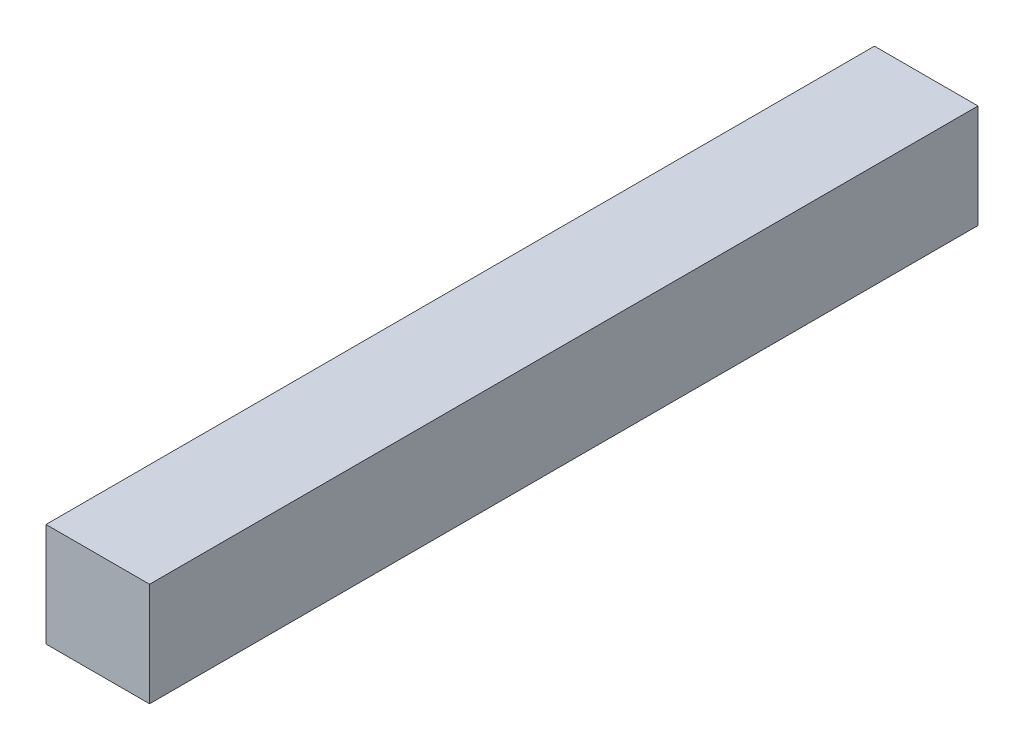
ISO-10303-21;
HEADER;
FILE_DESCRIPTION(('STEP AP214'),'2;1');
FILE_NAME('part.step','',(''),(''),'','','');
FILE_SCHEMA(('AUTOMOTIVE_DESIGN { 1 0 10303 214 1 1 1 1 }'));
ENDSEC;
DATA;
#1=APPLICATION_CONTEXT('core data for automotive mechanical design processes');
#2=APPLICATION_PROTOCOL_DEFINITION('international standard','automotive_design',2000,#1);
#3=PRODUCT_CONTEXT('',#1,'mechanical');
#4=PRODUCT('Part','Part','',(#3));
#5=PRODUCT_RELATED_PRODUCT_CATEGORY('part','',(#4));
#6=PRODUCT_DEFINITION_FORMATION('','',#4);
#7=PRODUCT_DEFINITION_CONTEXT('part definition',#1,'design');
#8=PRODUCT_DEFINITION('design','',#6,#7);
#9=PRODUCT_DEFINITION_SHAPE('','',#8);
#10=(LENGTH_UNIT() NAMED_UNIT(*) SI_UNIT(.MILLI.,.METRE.));
#11=(NAMED_UNIT(*) PLANE_ANGLE_UNIT() SI_UNIT($,.RADIAN.));
#12=(NAMED_UNIT(*) SI_UNIT($,.STERADIAN.) SOLID_ANGLE_UNIT());
#13=UNCERTAINTY_MEASURE_WITH_UNIT(LENGTH_MEASURE(1.E-05),#10,'distance_accuracy_value','');
#14=(GEOMETRIC_REPRESENTATION_CONTEXT(3) GLOBAL_UNCERTAINTY_ASSIGNED_CONTEXT((#13)) GLOBAL_UNIT_ASSIGNED_CONTEXT((#10,
#11,#12)) REPRESENTATION_CONTEXT('',''));
#15=CARTESIAN_POINT('',(0.,0.,0.));
#16=DIRECTION('',(0.,0.,1.));
#17=DIRECTION('',(1.,0.,0.));
#18=AXIS2_PLACEMENT_3D('',#15,#16,#17);
#19=CARTESIAN_POINT('',(0.,0.,-40.));
#20=DIRECTION('',(-1.,0.,0.));
#21=DIRECTION('',(0.,0.,1.));
#22=AXIS2_PLACEMENT_3D('',#19,#20,#21);
#23=PLANE('',#22);
#24=DIRECTION('',(0.,-1.,0.));
#25=VECTOR('',#24,1.);
#26=CARTESIAN_POINT('',(0.,0.,0.));
#27=LINE('',#26,#25);
#28=CARTESIAN_POINT('',(0.,5.,0.));
#29=VERTEX_POINT('',#28);
#30=CARTESIAN_POINT('',(0.,0.,0.));
#31=VERTEX_POINT('',#30);
#32=EDGE_CURVE('E106',#29,#31,#27,.T.);
#33=ORIENTED_EDGE('',*,*,#32,.F.);
#34=DIRECTION('',(0.,0.,1.));
#35=VECTOR('',#34,1.);
#36=CARTESIAN_POINT('',(0.,5.,-40.));
#37=LINE('',#36,#35);
#38=CARTESIAN_POINT('',(0.,5.,-40.));
#39=VERTEX_POINT('',#38);
#40=EDGE_CURVE('E11',#39,#29,#37,.T.);
#41=ORIENTED_EDGE('',*,*,#40,.F.);
#42=DIRECTION('',(0.,-1.,0.));
#43=VECTOR('',#42,1.);
#44=CARTESIAN_POINT('',(0.,0.,-40.));
#45=LINE('',#44,#43);
#46=CARTESIAN_POINT('',(0.,0.,-40.));
#47=VERTEX_POINT('',#46);
#48=EDGE_CURVE('E100',#39,#47,#45,.T.);
#49=ORIENTED_EDGE('',*,*,#48,.T.);
#50=DIRECTION('',(0.,0.,1.));
#51=VECTOR('',#50,1.);
#52=CARTESIAN_POINT('',(0.,0.,-40.));
#53=LINE('',#52,#51);
#54=EDGE_CURVE('E45',#47,#31,#53,.T.);
#55=ORIENTED_EDGE('',*,*,#54,.T.);
#56=EDGE_LOOP('',(#33,#41,#49,#55));
#57=FACE_BOUND('',#56,.T.);
#58=ADVANCED_FACE('F42',(#57),#23,.T.);
#59=CARTESIAN_POINT('',(0.,5.,-40.));
#60=DIRECTION('',(0.,1.,0.));
#61=DIRECTION('',(0.,0.,1.));
#62=AXIS2_PLACEMENT_3D('',#59,#60,#61);
#63=PLANE('',#62);
#64=DIRECTION('',(-1.,0.,0.));
#65=VECTOR('',#64,1.);
#66=CARTESIAN_POINT('',(0.,5.,0.));
#67=LINE('',#66,#65);
#68=CARTESIAN_POINT('',(5.,5.,0.));
#69=VERTEX_POINT('',#68);
#70=EDGE_CURVE('E102',#69,#29,#67,.T.);
#71=ORIENTED_EDGE('',*,*,#70,.F.);
#72=DIRECTION('',(0.,0.,1.));
#73=VECTOR('',#72,1.);
#74=CARTESIAN_POINT('',(5.,5.,-40.));
#75=LINE('',#74,#73);
#76=CARTESIAN_POINT('',(5.,5.,-40.));
#77=VERTEX_POINT('',#76);
#78=EDGE_CURVE('E51',#77,#69,#75,.T.);
#79=ORIENTED_EDGE('',*,*,#78,.F.);
#80=DIRECTION('',(-1.,0.,0.));
#81=VECTOR('',#80,1.);
#82=CARTESIAN_POINT('',(0.,5.,-40.));
#83=LINE('',#82,#81);
#84=EDGE_CURVE('E97',#77,#39,#83,.T.);
#85=ORIENTED_EDGE('',*,*,#84,.T.);
#86=ORIENTED_EDGE('',*,*,#40,.T.);
#87=EDGE_LOOP('',(#71,#79,#85,#86));
#88=FACE_BOUND('',#87,.T.);
#89=ADVANCED_FACE('F116',(#88),#63,.T.);
#90=CARTESIAN_POINT('',(5.,0.,-40.));
#91=DIRECTION('',(1.,0.,0.));
#92=DIRECTION('',(0.,0.,-1.));
#93=AXIS2_PLACEMENT_3D('',#90,#91,#92);
#94=PLANE('',#93);
#95=DIRECTION('',(0.,1.,0.));
#96=VECTOR('',#95,1.);
#97=CARTESIAN_POINT('',(5.,0.,0.));
#98=LINE('',#97,#96);
#99=CARTESIAN_POINT('',(5.,0.,0.));
#100=VERTEX_POINT('',#99);
#101=EDGE_CURVE('E92',#100,#69,#98,.T.);
#102=ORIENTED_EDGE('',*,*,#101,.F.);
#103=DIRECTION('',(0.,0.,1.));
#104=VECTOR('',#103,1.);
#105=CARTESIAN_POINT('',(5.,0.,-40.));
#106=LINE('',#105,#104);
#107=CARTESIAN_POINT('',(5.,0.,-40.));
#108=VERTEX_POINT('',#107);
#109=EDGE_CURVE('E87',#108,#100,#106,.T.);
#110=ORIENTED_EDGE('',*,*,#109,.F.);
#111=DIRECTION('',(0.,1.,0.));
#112=VECTOR('',#111,1.);
#113=CARTESIAN_POINT('',(5.,0.,-40.));
#114=LINE('',#113,#112);
#115=EDGE_CURVE('E90',#108,#77,#114,.T.);
#116=ORIENTED_EDGE('',*,*,#115,.T.);
#117=ORIENTED_EDGE('',*,*,#78,.T.);
#118=EDGE_LOOP('',(#102,#110,#116,#117));
#119=FACE_BOUND('',#118,.T.);
#120=ADVANCED_FACE('F89',(#119),#94,.T.);
#121=CARTESIAN_POINT('',(0.,0.,-40.));
#122=DIRECTION('',(0.,-1.,0.));
#123=DIRECTION('',(0.,0.,-1.));
#124=AXIS2_PLACEMENT_3D('',#121,#122,#123);
#125=PLANE('',#124);
#126=DIRECTION('',(1.,0.,0.));
#127=VECTOR('',#126,1.);
#128=CARTESIAN_POINT('',(0.,0.,0.));
#129=LINE('',#128,#127);
#130=EDGE_CURVE('E109',#31,#100,#129,.T.);
#131=ORIENTED_EDGE('',*,*,#130,.F.);
#132=ORIENTED_EDGE('',*,*,#54,.F.);
#133=DIRECTION('',(1.,0.,0.));
#134=VECTOR('',#133,1.);
#135=CARTESIAN_POINT('',(0.,0.,-40.));
#136=LINE('',#135,#134);
#137=EDGE_CURVE('E96',#47,#108,#136,.T.);
#138=ORIENTED_EDGE('',*,*,#137,.T.);
#139=ORIENTED_EDGE('',*,*,#109,.T.);
#140=EDGE_LOOP('',(#131,#132,#138,#139));
#141=FACE_BOUND('',#140,.T.);
#142=ADVANCED_FACE('F99',(#141),#125,.T.);
#143=CARTESIAN_POINT('',(0.,0.,-40.));
#144=DIRECTION('',(0.,0.,-1.));
#145=DIRECTION('',(-1.,0.,0.));
#146=AXIS2_PLACEMENT_3D('',#143,#144,#145);
#147=PLANE('',#146);
#148=ORIENTED_EDGE('',*,*,#48,.F.);
#149=ORIENTED_EDGE('',*,*,#84,.F.);
#150=ORIENTED_EDGE('',*,*,#115,.F.);
#151=ORIENTED_EDGE('',*,*,#137,.F.);
#152=EDGE_LOOP('',(#148,#149,#150,#151));
#153=FACE_BOUND('',#152,.T.);
#154=ADVANCED_FACE('F95',(#153),#147,.T.);
#155=CARTESIAN_POINT('',(0.,0.,0.));
#156=DIRECTION('',(0.,0.,-1.));
#157=DIRECTION('',(-1.,0.,0.));
#158=AXIS2_PLACEMENT_3D('',#155,#156,#157);
#159=PLANE('',#158);
#160=ORIENTED_EDGE('',*,*,#32,.T.);
#161=ORIENTED_EDGE('',*,*,#130,.T.);
#162=ORIENTED_EDGE('',*,*,#101,.T.);
#163=ORIENTED_EDGE('',*,*,#70,.T.);
#164=EDGE_LOOP('',(#160,#161,#162,#163));
#165=FACE_BOUND('',#164,.T.);
#166=ADVANCED_FACE('F115',(#165),#159,.F.);
#167=CLOSED_SHELL('',(#58,#89,#120,#142,#154,#166));
#168=MANIFOLD_SOLID_BREP('B2',#167);
#169=ADVANCED_BREP_SHAPE_REPRESENTATION('',(#18,#168),#14);
#170=SHAPE_DEFINITION_REPRESENTATION(#9,#169);
ENDSEC;
END-ISO-10303-21;
